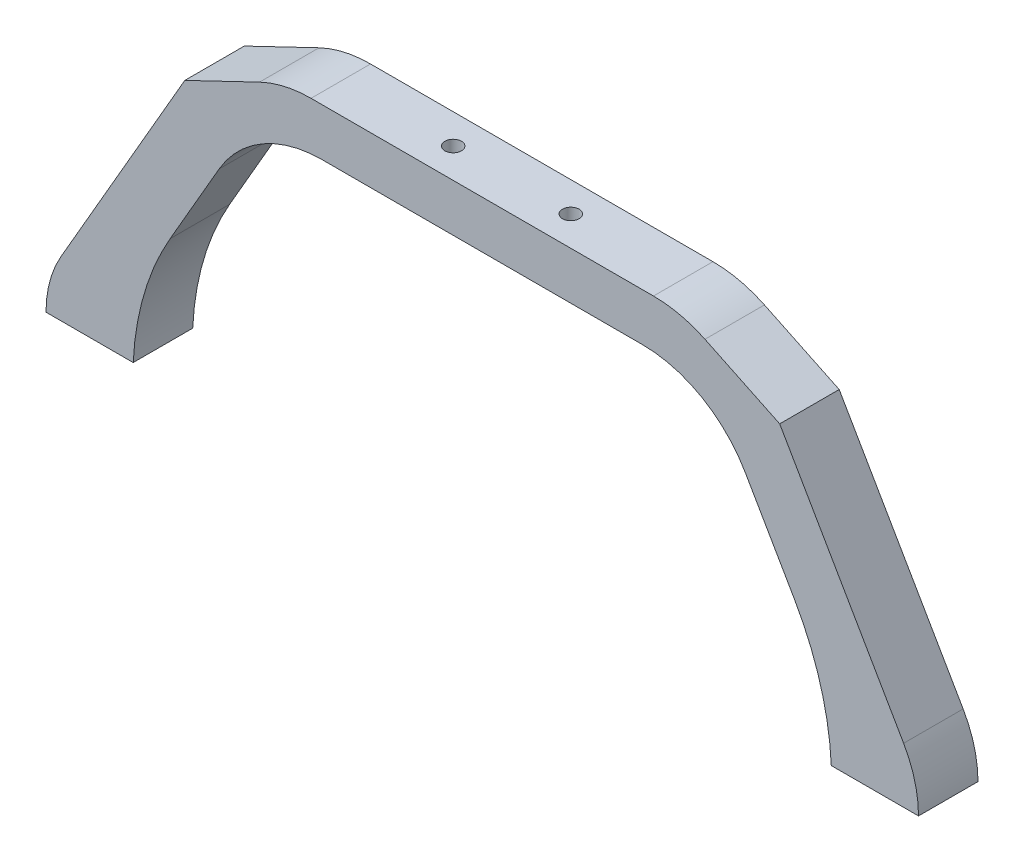
ISO-10303-21;
HEADER;
FILE_DESCRIPTION(('STEP AP214'),'2;1');
FILE_NAME('part.step','',(''),(''),'','','');
FILE_SCHEMA(('AUTOMOTIVE_DESIGN { 1 0 10303 214 1 1 1 1 }'));
ENDSEC;
DATA;
#1=APPLICATION_CONTEXT('core data for automotive mechanical design processes');
#2=APPLICATION_PROTOCOL_DEFINITION('international standard','automotive_design',2000,#1);
#3=PRODUCT_CONTEXT('',#1,'mechanical');
#4=PRODUCT('Part','Part','',(#3));
#5=PRODUCT_RELATED_PRODUCT_CATEGORY('part','',(#4));
#6=PRODUCT_DEFINITION_FORMATION('','',#4);
#7=PRODUCT_DEFINITION_CONTEXT('part definition',#1,'design');
#8=PRODUCT_DEFINITION('design','',#6,#7);
#9=PRODUCT_DEFINITION_SHAPE('','',#8);
#10=(LENGTH_UNIT() NAMED_UNIT(*) SI_UNIT(.MILLI.,.METRE.));
#11=(NAMED_UNIT(*) PLANE_ANGLE_UNIT() SI_UNIT($,.RADIAN.));
#12=(NAMED_UNIT(*) SI_UNIT($,.STERADIAN.) SOLID_ANGLE_UNIT());
#13=UNCERTAINTY_MEASURE_WITH_UNIT(LENGTH_MEASURE(1.E-05),#10,'distance_accuracy_value','');
#14=(GEOMETRIC_REPRESENTATION_CONTEXT(3) GLOBAL_UNCERTAINTY_ASSIGNED_CONTEXT((#13)) GLOBAL_UNIT_ASSIGNED_CONTEXT((#10,
#11,#12)) REPRESENTATION_CONTEXT('',''));
#15=CARTESIAN_POINT('',(0.,0.,0.));
#16=DIRECTION('',(0.,0.,1.));
#17=DIRECTION('',(1.,0.,0.));
#18=AXIS2_PLACEMENT_3D('',#15,#16,#17);
#19=CARTESIAN_POINT('',(14.8320799283025,62.1820813029437,0.));
#20=DIRECTION('',(0.,1.,0.));
#21=DIRECTION('',(0.,0.,1.));
#22=AXIS2_PLACEMENT_3D('',#19,#20,#21);
#23=CYLINDRICAL_SURFACE('',#22,2.1);
#24=CARTESIAN_POINT('',(14.8320799283025,80.1217782649107,0.));
#25=DIRECTION('',(0.,1.,0.));
#26=DIRECTION('',(0.,0.,1.));
#27=AXIS2_PLACEMENT_3D('',#24,#25,#26);
#28=CIRCLE('',#27,2.1);
#29=CARTESIAN_POINT('',(14.8320799283025,80.1217782649107,2.1));
#30=VERTEX_POINT('',#29);
#31=EDGE_CURVE('E297',#30,#30,#28,.T.);
#32=ORIENTED_EDGE('',*,*,#31,.T.);
#33=EDGE_LOOP('',(#32));
#34=FACE_BOUND('',#33,.T.);
#35=CARTESIAN_POINT('',(14.8320799283025,72.1217782649107,0.));
#36=DIRECTION('',(0.,-1.,0.));
#37=DIRECTION('',(0.,0.,-1.));
#38=AXIS2_PLACEMENT_3D('',#35,#36,#37);
#39=CIRCLE('',#38,2.1);
#40=CARTESIAN_POINT('',(14.8320799283025,72.1217782649107,-2.10000000000001));
#41=VERTEX_POINT('',#40);
#42=EDGE_CURVE('E299',#41,#41,#39,.T.);
#43=ORIENTED_EDGE('',*,*,#42,.T.);
#44=EDGE_LOOP('',(#43));
#45=FACE_BOUND('',#44,.T.);
#46=ADVANCED_FACE('F49',(#34,#45),#23,.F.);
#47=CARTESIAN_POINT('',(-14.8320799283025,62.1820813029437,0.));
#48=DIRECTION('',(0.,1.,0.));
#49=DIRECTION('',(0.,0.,1.));
#50=AXIS2_PLACEMENT_3D('',#47,#48,#49);
#51=CYLINDRICAL_SURFACE('',#50,2.1);
#52=CARTESIAN_POINT('',(-14.8320799283025,80.1217782649107,0.));
#53=DIRECTION('',(0.,1.,0.));
#54=DIRECTION('',(0.,0.,1.));
#55=AXIS2_PLACEMENT_3D('',#52,#53,#54);
#56=CIRCLE('',#55,2.1);
#57=CARTESIAN_POINT('',(-14.8320799283025,80.1217782649107,2.1));
#58=VERTEX_POINT('',#57);
#59=EDGE_CURVE('E315',#58,#58,#56,.T.);
#60=ORIENTED_EDGE('',*,*,#59,.T.);
#61=EDGE_LOOP('',(#60));
#62=FACE_BOUND('',#61,.T.);
#63=CARTESIAN_POINT('',(-14.8320799283025,72.1217782649107,0.));
#64=DIRECTION('',(0.,-1.,0.));
#65=DIRECTION('',(0.,0.,-1.));
#66=AXIS2_PLACEMENT_3D('',#63,#64,#65);
#67=CIRCLE('',#66,2.1);
#68=CARTESIAN_POINT('',(-14.8320799283025,72.1217782649107,-2.1));
#69=VERTEX_POINT('',#68);
#70=EDGE_CURVE('E308',#69,#69,#67,.T.);
#71=ORIENTED_EDGE('',*,*,#70,.T.);
#72=EDGE_LOOP('',(#71));
#73=FACE_BOUND('',#72,.T.);
#74=ADVANCED_FACE('F472',(#62,#73),#51,.F.);
#75=CARTESIAN_POINT('',(0.,-1.34593086169958E-13,7.5));
#76=DIRECTION('',(0.,-1.,0.));
#77=DIRECTION('',(1.,0.,0.));
#78=AXIS2_PLACEMENT_3D('',#75,#76,#77);
#79=PLANE('',#78);
#80=DIRECTION('',(-1.,0.,0.));
#81=VECTOR('',#80,1.);
#82=CARTESIAN_POINT('',(0.,-1.34593086169958E-13,-7.5));
#83=LINE('',#82,#81);
#84=CARTESIAN_POINT('',(-88.0096189432335,0.,-7.5));
#85=VERTEX_POINT('',#84);
#86=CARTESIAN_POINT('',(-110.,0.,-7.5));
#87=VERTEX_POINT('',#86);
#88=EDGE_CURVE('E319',#85,#87,#83,.T.);
#89=ORIENTED_EDGE('',*,*,#88,.F.);
#90=DIRECTION('',(0.,0.,-1.));
#91=VECTOR('',#90,1.);
#92=CARTESIAN_POINT('',(-88.0096189432335,0.,7.5));
#93=LINE('',#92,#91);
#94=CARTESIAN_POINT('',(-88.0096189432335,0.,7.5));
#95=VERTEX_POINT('',#94);
#96=EDGE_CURVE('E198',#95,#85,#93,.T.);
#97=ORIENTED_EDGE('',*,*,#96,.F.);
#98=DIRECTION('',(-1.,0.,0.));
#99=VECTOR('',#98,1.);
#100=CARTESIAN_POINT('',(0.,-1.34593086169958E-13,7.5));
#101=LINE('',#100,#99);
#102=CARTESIAN_POINT('',(-110.,0.,7.5));
#103=VERTEX_POINT('',#102);
#104=EDGE_CURVE('E182',#95,#103,#101,.T.);
#105=ORIENTED_EDGE('',*,*,#104,.T.);
#106=DIRECTION('',(0.,0.,-1.));
#107=VECTOR('',#106,1.);
#108=CARTESIAN_POINT('',(-110.,0.,7.5));
#109=LINE('',#108,#107);
#110=EDGE_CURVE('E195',#103,#87,#109,.T.);
#111=ORIENTED_EDGE('',*,*,#110,.T.);
#112=EDGE_LOOP('',(#89,#97,#105,#111));
#113=FACE_BOUND('',#112,.T.);
#114=ADVANCED_FACE('F194',(#113),#79,.T.);
#115=CARTESIAN_POINT('',(-72.757214207425,42.0063972081442,7.5));
#116=DIRECTION('',(0.866025403784438,-0.500000000000001,0.));
#117=DIRECTION('',(0.500000000000001,0.866025403784438,0.));
#118=AXIS2_PLACEMENT_3D('',#115,#116,#117);
#119=PLANE('',#118);
#120=DIRECTION('',(-0.500000000000001,-0.866025403784438,0.));
#121=VECTOR('',#120,1.);
#122=CARTESIAN_POINT('',(-72.757214207425,42.0063972081442,7.5));
#123=LINE('',#122,#121);
#124=CARTESIAN_POINT('',(-66.3397459621556,53.1217782649107,7.5));
#125=VERTEX_POINT('',#124);
#126=CARTESIAN_POINT('',(-78.709369655696,31.696961557191,7.5));
#127=VERTEX_POINT('',#126);
#128=EDGE_CURVE('E200',#125,#127,#123,.T.);
#129=ORIENTED_EDGE('',*,*,#128,.T.);
#130=DIRECTION('',(0.,0.,-1.));
#131=VECTOR('',#130,1.);
#132=CARTESIAN_POINT('',(-78.709369655696,31.696961557191,-7.5));
#133=LINE('',#132,#131);
#134=CARTESIAN_POINT('',(-78.709369655696,31.696961557191,-7.5));
#135=VERTEX_POINT('',#134);
#136=EDGE_CURVE('E222',#127,#135,#133,.T.);
#137=ORIENTED_EDGE('',*,*,#136,.T.);
#138=DIRECTION('',(-0.500000000000001,-0.866025403784438,0.));
#139=VECTOR('',#138,1.);
#140=CARTESIAN_POINT('',(-72.757214207425,42.0063972081442,-7.5));
#141=LINE('',#140,#139);
#142=CARTESIAN_POINT('',(-66.3397459621556,53.1217782649107,-7.5));
#143=VERTEX_POINT('',#142);
#144=EDGE_CURVE('E356',#143,#135,#141,.T.);
#145=ORIENTED_EDGE('',*,*,#144,.F.);
#146=DIRECTION('',(0.,0.,-1.));
#147=VECTOR('',#146,1.);
#148=CARTESIAN_POINT('',(-66.3397459621556,53.1217782649107,7.5));
#149=LINE('',#148,#147);
#150=EDGE_CURVE('E219',#143,#125,#149,.F.);
#151=ORIENTED_EDGE('',*,*,#150,.T.);
#152=EDGE_LOOP('',(#129,#137,#145,#151));
#153=FACE_BOUND('',#152,.T.);
#154=ADVANCED_FACE('F445',(#153),#119,.T.);
#155=CARTESIAN_POINT('',(0.,68.1217782649107,7.5));
#156=DIRECTION('',(0.,-1.,0.));
#157=DIRECTION('',(0.,0.,-1.));
#158=AXIS2_PLACEMENT_3D('',#155,#156,#157);
#159=PLANE('',#158);
#160=CARTESIAN_POINT('',(14.8320799283025,68.1217782649107,0.));
#161=DIRECTION('',(0.,-1.,0.));
#162=DIRECTION('',(0.,0.,-1.));
#163=AXIS2_PLACEMENT_3D('',#160,#161,#162);
#164=CIRCLE('',#163,4.5);
#165=CARTESIAN_POINT('',(14.8320799283025,68.1217782649107,-4.50000000000001));
#166=VERTEX_POINT('',#165);
#167=EDGE_CURVE('E53',#166,#166,#164,.T.);
#168=ORIENTED_EDGE('',*,*,#167,.F.);
#169=EDGE_LOOP('',(#168));
#170=FACE_BOUND('',#169,.T.);
#171=CARTESIAN_POINT('',(-14.8320799283025,68.1217782649107,0.));
#172=DIRECTION('',(0.,-1.,0.));
#173=DIRECTION('',(0.,0.,-1.));
#174=AXIS2_PLACEMENT_3D('',#171,#172,#173);
#175=CIRCLE('',#174,4.5);
#176=CARTESIAN_POINT('',(-14.8320799283025,68.1217782649107,-4.5));
#177=VERTEX_POINT('',#176);
#178=EDGE_CURVE('E288',#177,#177,#175,.T.);
#179=ORIENTED_EDGE('',*,*,#178,.F.);
#180=EDGE_LOOP('',(#179));
#181=FACE_BOUND('',#180,.T.);
#182=DIRECTION('',(-1.,0.,0.));
#183=VECTOR('',#182,1.);
#184=CARTESIAN_POINT('',(0.,68.1217782649107,-7.5));
#185=LINE('',#184,#183);
#186=CARTESIAN_POINT('',(40.3589838486224,68.1217782649107,-7.5));
#187=VERTEX_POINT('',#186);
#188=CARTESIAN_POINT('',(-40.3589838486224,68.1217782649107,-7.5));
#189=VERTEX_POINT('',#188);
#190=EDGE_CURVE('E360',#187,#189,#185,.T.);
#191=ORIENTED_EDGE('',*,*,#190,.F.);
#192=DIRECTION('',(0.,0.,-1.));
#193=VECTOR('',#192,1.);
#194=CARTESIAN_POINT('',(40.3589838486224,68.1217782649107,7.5));
#195=LINE('',#194,#193);
#196=CARTESIAN_POINT('',(40.3589838486224,68.1217782649107,7.5));
#197=VERTEX_POINT('',#196);
#198=EDGE_CURVE('E230',#187,#197,#195,.F.);
#199=ORIENTED_EDGE('',*,*,#198,.T.);
#200=DIRECTION('',(-1.,0.,0.));
#201=VECTOR('',#200,1.);
#202=CARTESIAN_POINT('',(0.,68.1217782649107,7.5));
#203=LINE('',#202,#201);
#204=CARTESIAN_POINT('',(-40.3589838486224,68.1217782649107,7.5));
#205=VERTEX_POINT('',#204);
#206=EDGE_CURVE('E326',#197,#205,#203,.T.);
#207=ORIENTED_EDGE('',*,*,#206,.T.);
#208=DIRECTION('',(0.,0.,-1.));
#209=VECTOR('',#208,1.);
#210=CARTESIAN_POINT('',(-40.3589838486224,68.1217782649107,-7.5));
#211=LINE('',#210,#209);
#212=EDGE_CURVE('E226',#205,#189,#211,.T.);
#213=ORIENTED_EDGE('',*,*,#212,.T.);
#214=EDGE_LOOP('',(#191,#199,#207,#213));
#215=FACE_BOUND('',#214,.T.);
#216=ADVANCED_FACE('F433',(#170,#181,#215),#159,.T.);
#217=CARTESIAN_POINT('',(72.757214207425,42.0063972081442,7.5));
#218=DIRECTION('',(0.866025403784438,0.500000000000001,0.));
#219=DIRECTION('',(-0.500000000000001,0.866025403784438,0.));
#220=AXIS2_PLACEMENT_3D('',#217,#218,#219);
#221=PLANE('',#220);
#222=DIRECTION('',(0.500000000000001,-0.866025403784438,0.));
#223=VECTOR('',#222,1.);
#224=CARTESIAN_POINT('',(72.757214207425,42.0063972081442,-7.5));
#225=LINE('',#224,#223);
#226=CARTESIAN_POINT('',(66.3397459621556,53.1217782649107,-7.5));
#227=VERTEX_POINT('',#226);
#228=CARTESIAN_POINT('',(78.709369655696,31.696961557191,-7.5));
#229=VERTEX_POINT('',#228);
#230=EDGE_CURVE('E364',#227,#229,#225,.T.);
#231=ORIENTED_EDGE('',*,*,#230,.T.);
#232=DIRECTION('',(0.,0.,-1.));
#233=VECTOR('',#232,1.);
#234=CARTESIAN_POINT('',(78.709369655696,31.696961557191,7.5));
#235=LINE('',#234,#233);
#236=CARTESIAN_POINT('',(78.709369655696,31.696961557191,7.5));
#237=VERTEX_POINT('',#236);
#238=EDGE_CURVE('E211',#229,#237,#235,.F.);
#239=ORIENTED_EDGE('',*,*,#238,.T.);
#240=DIRECTION('',(0.500000000000001,-0.866025403784438,0.));
#241=VECTOR('',#240,1.);
#242=CARTESIAN_POINT('',(72.757214207425,42.0063972081442,7.5));
#243=LINE('',#242,#241);
#244=CARTESIAN_POINT('',(66.3397459621556,53.1217782649107,7.5));
#245=VERTEX_POINT('',#244);
#246=EDGE_CURVE('E330',#245,#237,#243,.T.);
#247=ORIENTED_EDGE('',*,*,#246,.F.);
#248=DIRECTION('',(0.,0.,-1.));
#249=VECTOR('',#248,1.);
#250=CARTESIAN_POINT('',(66.3397459621556,53.1217782649107,7.5));
#251=LINE('',#250,#249);
#252=EDGE_CURVE('E206',#245,#227,#251,.T.);
#253=ORIENTED_EDGE('',*,*,#252,.T.);
#254=EDGE_LOOP('',(#231,#239,#247,#253));
#255=FACE_BOUND('',#254,.T.);
#256=ADVANCED_FACE('F427',(#255),#221,.F.);
#257=CARTESIAN_POINT('',(0.,-1.34593086169958E-13,7.5));
#258=DIRECTION('',(0.,1.,0.));
#259=DIRECTION('',(-1.,0.,0.));
#260=AXIS2_PLACEMENT_3D('',#257,#258,#259);
#261=PLANE('',#260);
#262=DIRECTION('',(1.,0.,0.));
#263=VECTOR('',#262,1.);
#264=CARTESIAN_POINT('',(0.,-1.34593086169958E-13,-7.5));
#265=LINE('',#264,#263);
#266=CARTESIAN_POINT('',(88.0096189432335,0.,-7.5));
#267=VERTEX_POINT('',#266);
#268=CARTESIAN_POINT('',(110.,0.,-7.5));
#269=VERTEX_POINT('',#268);
#270=EDGE_CURVE('E368',#267,#269,#265,.T.);
#271=ORIENTED_EDGE('',*,*,#270,.T.);
#272=DIRECTION('',(0.,0.,-1.));
#273=VECTOR('',#272,1.);
#274=CARTESIAN_POINT('',(110.,0.,7.5));
#275=LINE('',#274,#273);
#276=CARTESIAN_POINT('',(110.,0.,7.5));
#277=VERTEX_POINT('',#276);
#278=EDGE_CURVE('E396',#277,#269,#275,.T.);
#279=ORIENTED_EDGE('',*,*,#278,.F.);
#280=DIRECTION('',(1.,0.,0.));
#281=VECTOR('',#280,1.);
#282=CARTESIAN_POINT('',(0.,-1.34593086169958E-13,7.5));
#283=LINE('',#282,#281);
#284=CARTESIAN_POINT('',(88.0096189432335,0.,7.5));
#285=VERTEX_POINT('',#284);
#286=EDGE_CURVE('E334',#285,#277,#283,.T.);
#287=ORIENTED_EDGE('',*,*,#286,.F.);
#288=DIRECTION('',(0.,0.,-1.));
#289=VECTOR('',#288,1.);
#290=CARTESIAN_POINT('',(88.0096189432335,0.,7.5));
#291=LINE('',#290,#289);
#292=EDGE_CURVE('E213',#285,#267,#291,.T.);
#293=ORIENTED_EDGE('',*,*,#292,.T.);
#294=EDGE_LOOP('',(#271,#279,#287,#293));
#295=FACE_BOUND('',#294,.T.);
#296=ADVANCED_FACE('F405',(#295),#261,.F.);
#297=CARTESIAN_POINT('',(85.7475952641916,49.5063972081442,7.5));
#298=DIRECTION('',(-0.866025403784438,-0.500000000000001,0.));
#299=DIRECTION('',(0.500000000000001,-0.866025403784438,0.));
#300=AXIS2_PLACEMENT_3D('',#297,#298,#299);
#301=PLANE('',#300);
#302=DIRECTION('',(-0.500000000000001,0.866025403784438,0.));
#303=VECTOR('',#302,1.);
#304=CARTESIAN_POINT('',(85.7475952641916,49.5063972081442,7.5));
#305=LINE('',#304,#303);
#306=CARTESIAN_POINT('',(106.248711424607,13.9974224064335,7.5));
#307=VERTEX_POINT('',#306);
#308=CARTESIAN_POINT('',(75.,68.1217782649107,7.5));
#309=VERTEX_POINT('',#308);
#310=EDGE_CURVE('E337',#307,#309,#305,.T.);
#311=ORIENTED_EDGE('',*,*,#310,.F.);
#312=DIRECTION('',(0.,0.,-1.));
#313=VECTOR('',#312,1.);
#314=CARTESIAN_POINT('',(106.248711424607,13.9974224064335,7.5));
#315=LINE('',#314,#313);
#316=CARTESIAN_POINT('',(106.248711424607,13.9974224064335,-7.5));
#317=VERTEX_POINT('',#316);
#318=EDGE_CURVE('E257',#307,#317,#315,.T.);
#319=ORIENTED_EDGE('',*,*,#318,.T.);
#320=DIRECTION('',(-0.500000000000001,0.866025403784438,0.));
#321=VECTOR('',#320,1.);
#322=CARTESIAN_POINT('',(85.7475952641916,49.5063972081442,-7.5));
#323=LINE('',#322,#321);
#324=CARTESIAN_POINT('',(75.,68.1217782649107,-7.5));
#325=VERTEX_POINT('',#324);
#326=EDGE_CURVE('E372',#317,#325,#323,.T.);
#327=ORIENTED_EDGE('',*,*,#326,.T.);
#328=DIRECTION('',(0.,0.,-1.));
#329=VECTOR('',#328,1.);
#330=CARTESIAN_POINT('',(75.,68.1217782649107,7.5));
#331=LINE('',#330,#329);
#332=EDGE_CURVE('E392',#309,#325,#331,.T.);
#333=ORIENTED_EDGE('',*,*,#332,.F.);
#334=EDGE_LOOP('',(#311,#319,#327,#333));
#335=FACE_BOUND('',#334,.T.);
#336=ADVANCED_FACE('F419',(#335),#301,.F.);
#337=CARTESIAN_POINT('',(40.6196794271433,84.6243321398819,7.5));
#338=DIRECTION('',(0.432731067584771,0.901523057468273,0.));
#339=DIRECTION('',(-0.901523057468274,0.432731067584771,0.));
#340=AXIS2_PLACEMENT_3D('',#337,#338,#339);
#341=PLANE('',#340);
#342=DIRECTION('',(0.901523057468274,-0.432731067584771,0.));
#343=VECTOR('',#342,1.);
#344=CARTESIAN_POINT('',(40.6196794271433,84.6243321398819,-7.5));
#345=LINE('',#344,#343);
#346=CARTESIAN_POINT('',(56.1548089082329,77.1674699889589,-7.5));
#347=VERTEX_POINT('',#346);
#348=EDGE_CURVE('E376',#347,#325,#345,.T.);
#349=ORIENTED_EDGE('',*,*,#348,.F.);
#350=DIRECTION('',(0.,0.,-1.));
#351=VECTOR('',#350,1.);
#352=CARTESIAN_POINT('',(56.1548089082329,77.1674699889589,7.5));
#353=LINE('',#352,#351);
#354=CARTESIAN_POINT('',(56.1548089082329,77.1674699889589,7.5));
#355=VERTEX_POINT('',#354);
#356=EDGE_CURVE('E59',#347,#355,#353,.F.);
#357=ORIENTED_EDGE('',*,*,#356,.T.);
#358=DIRECTION('',(0.901523057468274,-0.432731067584771,0.));
#359=VECTOR('',#358,1.);
#360=CARTESIAN_POINT('',(40.6196794271433,84.6243321398819,7.5));
#361=LINE('',#360,#359);
#362=EDGE_CURVE('E341',#355,#309,#361,.T.);
#363=ORIENTED_EDGE('',*,*,#362,.T.);
#364=ORIENTED_EDGE('',*,*,#332,.T.);
#365=EDGE_LOOP('',(#349,#357,#363,#364));
#366=FACE_BOUND('',#365,.T.);
#367=ADVANCED_FACE('F492',(#366),#341,.T.);
#368=CARTESIAN_POINT('',(0.,80.1217782649107,7.5));
#369=DIRECTION('',(0.,1.,0.));
#370=DIRECTION('',(0.,0.,1.));
#371=AXIS2_PLACEMENT_3D('',#368,#369,#370);
#372=PLANE('',#371);
#373=ORIENTED_EDGE('',*,*,#59,.F.);
#374=EDGE_LOOP('',(#373));
#375=FACE_BOUND('',#374,.T.);
#376=ORIENTED_EDGE('',*,*,#31,.F.);
#377=EDGE_LOOP('',(#376));
#378=FACE_BOUND('',#377,.T.);
#379=DIRECTION('',(1.,0.,0.));
#380=VECTOR('',#379,1.);
#381=CARTESIAN_POINT('',(0.,80.1217782649107,7.5));
#382=LINE('',#381,#380);
#383=CARTESIAN_POINT('',(-43.1728768806898,80.1217782649107,7.5));
#384=VERTEX_POINT('',#383);
#385=CARTESIAN_POINT('',(43.1728768806898,80.1217782649107,7.5));
#386=VERTEX_POINT('',#385);
#387=EDGE_CURVE('E344',#384,#386,#382,.T.);
#388=ORIENTED_EDGE('',*,*,#387,.T.);
#389=DIRECTION('',(0.,0.,-1.));
#390=VECTOR('',#389,1.);
#391=CARTESIAN_POINT('',(43.1728768806898,80.1217782649107,7.5));
#392=LINE('',#391,#390);
#393=CARTESIAN_POINT('',(43.1728768806898,80.1217782649107,-7.5));
#394=VERTEX_POINT('',#393);
#395=EDGE_CURVE('E283',#386,#394,#392,.T.);
#396=ORIENTED_EDGE('',*,*,#395,.T.);
#397=DIRECTION('',(1.,0.,0.));
#398=VECTOR('',#397,1.);
#399=CARTESIAN_POINT('',(0.,80.1217782649107,-7.5));
#400=LINE('',#399,#398);
#401=CARTESIAN_POINT('',(-43.1728768806898,80.1217782649107,-7.5));
#402=VERTEX_POINT('',#401);
#403=EDGE_CURVE('E379',#402,#394,#400,.T.);
#404=ORIENTED_EDGE('',*,*,#403,.F.);
#405=DIRECTION('',(0.,0.,-1.));
#406=VECTOR('',#405,1.);
#407=CARTESIAN_POINT('',(-43.1728768806898,80.1217782649107,7.5));
#408=LINE('',#407,#406);
#409=EDGE_CURVE('E280',#402,#384,#408,.F.);
#410=ORIENTED_EDGE('',*,*,#409,.T.);
#411=EDGE_LOOP('',(#388,#396,#404,#410));
#412=FACE_BOUND('',#411,.T.);
#413=ADVANCED_FACE('F459',(#375,#378,#412),#372,.T.);
#414=CARTESIAN_POINT('',(-40.6196794271433,84.6243321398819,7.5));
#415=DIRECTION('',(-0.432731067584771,0.901523057468273,0.));
#416=DIRECTION('',(-0.901523057468274,-0.432731067584771,0.));
#417=AXIS2_PLACEMENT_3D('',#414,#415,#416);
#418=PLANE('',#417);
#419=DIRECTION('',(0.901523057468274,0.432731067584771,0.));
#420=VECTOR('',#419,1.);
#421=CARTESIAN_POINT('',(-40.6196794271433,84.6243321398819,7.5));
#422=LINE('',#421,#420);
#423=CARTESIAN_POINT('',(-75.,68.1217782649107,7.5));
#424=VERTEX_POINT('',#423);
#425=CARTESIAN_POINT('',(-56.1548089082329,77.1674699889589,7.5));
#426=VERTEX_POINT('',#425);
#427=EDGE_CURVE('E348',#424,#426,#422,.T.);
#428=ORIENTED_EDGE('',*,*,#427,.T.);
#429=DIRECTION('',(0.,0.,-1.));
#430=VECTOR('',#429,1.);
#431=CARTESIAN_POINT('',(-56.1548089082329,77.1674699889589,7.5));
#432=LINE('',#431,#430);
#433=CARTESIAN_POINT('',(-56.1548089082329,77.1674699889589,-7.5));
#434=VERTEX_POINT('',#433);
#435=EDGE_CURVE('E12',#426,#434,#432,.T.);
#436=ORIENTED_EDGE('',*,*,#435,.T.);
#437=DIRECTION('',(0.901523057468274,0.432731067584771,0.));
#438=VECTOR('',#437,1.);
#439=CARTESIAN_POINT('',(-40.6196794271433,84.6243321398819,-7.5));
#440=LINE('',#439,#438);
#441=CARTESIAN_POINT('',(-75.,68.1217782649107,-7.5));
#442=VERTEX_POINT('',#441);
#443=EDGE_CURVE('E383',#442,#434,#440,.T.);
#444=ORIENTED_EDGE('',*,*,#443,.F.);
#445=DIRECTION('',(0.,0.,-1.));
#446=VECTOR('',#445,1.);
#447=CARTESIAN_POINT('',(-75.,68.1217782649107,7.5));
#448=LINE('',#447,#446);
#449=EDGE_CURVE('E353',#424,#442,#448,.T.);
#450=ORIENTED_EDGE('',*,*,#449,.F.);
#451=EDGE_LOOP('',(#428,#436,#444,#450));
#452=FACE_BOUND('',#451,.T.);
#453=ADVANCED_FACE('F453',(#452),#418,.T.);
#454=CARTESIAN_POINT('',(-85.7475952641916,49.5063972081442,7.5));
#455=DIRECTION('',(-0.866025403784438,0.500000000000001,0.));
#456=DIRECTION('',(-0.500000000000001,-0.866025403784438,0.));
#457=AXIS2_PLACEMENT_3D('',#454,#455,#456);
#458=PLANE('',#457);
#459=DIRECTION('',(0.500000000000001,0.866025403784438,0.));
#460=VECTOR('',#459,1.);
#461=CARTESIAN_POINT('',(-85.7475952641916,49.5063972081442,-7.5));
#462=LINE('',#461,#460);
#463=CARTESIAN_POINT('',(-106.248711424607,13.9974224064335,-7.5));
#464=VERTEX_POINT('',#463);
#465=EDGE_CURVE('E201',#464,#442,#462,.T.);
#466=ORIENTED_EDGE('',*,*,#465,.F.);
#467=DIRECTION('',(0.,0.,-1.));
#468=VECTOR('',#467,1.);
#469=CARTESIAN_POINT('',(-106.248711424607,13.9974224064335,7.5));
#470=LINE('',#469,#468);
#471=CARTESIAN_POINT('',(-106.248711424607,13.9974224064335,7.5));
#472=VERTEX_POINT('',#471);
#473=EDGE_CURVE('E67',#464,#472,#470,.F.);
#474=ORIENTED_EDGE('',*,*,#473,.T.);
#475=DIRECTION('',(0.500000000000001,0.866025403784438,0.));
#476=VECTOR('',#475,1.);
#477=CARTESIAN_POINT('',(-85.7475952641916,49.5063972081442,7.5));
#478=LINE('',#477,#476);
#479=EDGE_CURVE('E184',#472,#424,#478,.T.);
#480=ORIENTED_EDGE('',*,*,#479,.T.);
#481=ORIENTED_EDGE('',*,*,#449,.T.);
#482=EDGE_LOOP('',(#466,#474,#480,#481));
#483=FACE_BOUND('',#482,.T.);
#484=ADVANCED_FACE('F449',(#483),#458,.T.);
#485=CARTESIAN_POINT('',(0.,0.,7.5));
#486=DIRECTION('',(0.,0.,1.));
#487=DIRECTION('',(1.,0.,0.));
#488=AXIS2_PLACEMENT_3D('',#485,#486,#487);
#489=PLANE('',#488);
#490=ORIENTED_EDGE('',*,*,#286,.T.);
#491=CARTESIAN_POINT('',(82.0000001186427,-0.00257759356656756,7.5));
#492=DIRECTION('',(0.,0.,1.));
#493=DIRECTION('',(1.,0.,0.));
#494=AXIS2_PLACEMENT_3D('',#491,#492,#493);
#495=CIRCLE('',#494,28.);
#496=EDGE_CURVE('E188',#277,#307,#495,.T.);
#497=ORIENTED_EDGE('',*,*,#496,.T.);
#498=ORIENTED_EDGE('',*,*,#310,.T.);
#499=ORIENTED_EDGE('',*,*,#362,.F.);
#500=CARTESIAN_POINT('',(43.1728768806898,50.1217782649107,7.5));
#501=DIRECTION('',(0.,0.,1.));
#502=DIRECTION('',(1.,0.,0.));
#503=AXIS2_PLACEMENT_3D('',#500,#501,#502);
#504=CIRCLE('',#503,30.);
#505=EDGE_CURVE('E189',#355,#386,#504,.T.);
#506=ORIENTED_EDGE('',*,*,#505,.T.);
#507=ORIENTED_EDGE('',*,*,#387,.F.);
#508=CARTESIAN_POINT('',(-43.1728768806898,50.1217782649107,7.5));
#509=DIRECTION('',(0.,0.,1.));
#510=DIRECTION('',(1.,0.,0.));
#511=AXIS2_PLACEMENT_3D('',#508,#509,#510);
#512=CIRCLE('',#511,30.);
#513=EDGE_CURVE('E75',#384,#426,#512,.T.);
#514=ORIENTED_EDGE('',*,*,#513,.T.);
#515=ORIENTED_EDGE('',*,*,#427,.F.);
#516=ORIENTED_EDGE('',*,*,#479,.F.);
#517=CARTESIAN_POINT('',(-82.0000001186427,-0.00257759356656756,7.5));
#518=DIRECTION('',(0.,0.,1.));
#519=DIRECTION('',(1.,0.,0.));
#520=AXIS2_PLACEMENT_3D('',#517,#518,#519);
#521=CIRCLE('',#520,28.);
#522=EDGE_CURVE('E179',#472,#103,#521,.T.);
#523=ORIENTED_EDGE('',*,*,#522,.T.);
#524=ORIENTED_EDGE('',*,*,#104,.F.);
#525=CARTESIAN_POINT('',(-18.0875913907853,-3.30303844280911,7.5));
#526=DIRECTION('',(0.,0.,1.));
#527=DIRECTION('',(1.,0.,0.));
#528=AXIS2_PLACEMENT_3D('',#525,#526,#527);
#529=CIRCLE('',#528,70.);
#530=EDGE_CURVE('E242',#95,#127,#529,.F.);
#531=ORIENTED_EDGE('',*,*,#530,.T.);
#532=ORIENTED_EDGE('',*,*,#128,.F.);
#533=CARTESIAN_POINT('',(-40.3589838486224,38.1217782649107,7.5));
#534=DIRECTION('',(0.,0.,1.));
#535=DIRECTION('',(1.,0.,0.));
#536=AXIS2_PLACEMENT_3D('',#533,#534,#535);
#537=CIRCLE('',#536,30.);
#538=EDGE_CURVE('E254',#125,#205,#537,.F.);
#539=ORIENTED_EDGE('',*,*,#538,.T.);
#540=ORIENTED_EDGE('',*,*,#206,.F.);
#541=CARTESIAN_POINT('',(40.3589838486224,38.1217782649107,7.5));
#542=DIRECTION('',(0.,0.,1.));
#543=DIRECTION('',(1.,0.,0.));
#544=AXIS2_PLACEMENT_3D('',#541,#542,#543);
#545=CIRCLE('',#544,30.);
#546=EDGE_CURVE('E248',#197,#245,#545,.F.);
#547=ORIENTED_EDGE('',*,*,#546,.T.);
#548=ORIENTED_EDGE('',*,*,#246,.T.);
#549=CARTESIAN_POINT('',(18.0875913907853,-3.30303844280911,7.5));
#550=DIRECTION('',(0.,0.,1.));
#551=DIRECTION('',(1.,0.,0.));
#552=AXIS2_PLACEMENT_3D('',#549,#550,#551);
#553=CIRCLE('',#552,70.);
#554=EDGE_CURVE('E236',#237,#285,#553,.F.);
#555=ORIENTED_EDGE('',*,*,#554,.T.);
#556=EDGE_LOOP('',(#490,#497,#498,#499,#506,#507,#514,#515,#516,#523,#524,#531,#532,#539,#540,
#547,#548,#555));
#557=FACE_BOUND('',#556,.T.);
#558=ADVANCED_FACE('F181',(#557),#489,.T.);
#559=CARTESIAN_POINT('',(0.,0.,-7.5));
#560=DIRECTION('',(0.,0.,1.));
#561=DIRECTION('',(1.,0.,0.));
#562=AXIS2_PLACEMENT_3D('',#559,#560,#561);
#563=PLANE('',#562);
#564=ORIENTED_EDGE('',*,*,#326,.F.);
#565=CARTESIAN_POINT('',(82.0000001186427,-0.00257759356656756,-7.5));
#566=DIRECTION('',(0.,0.,1.));
#567=DIRECTION('',(1.,0.,0.));
#568=AXIS2_PLACEMENT_3D('',#565,#566,#567);
#569=CIRCLE('',#568,28.);
#570=EDGE_CURVE('E269',#317,#269,#569,.F.);
#571=ORIENTED_EDGE('',*,*,#570,.T.);
#572=ORIENTED_EDGE('',*,*,#270,.F.);
#573=CARTESIAN_POINT('',(18.0875913907853,-3.30303844280911,-7.5));
#574=DIRECTION('',(0.,0.,1.));
#575=DIRECTION('',(1.,0.,0.));
#576=AXIS2_PLACEMENT_3D('',#573,#574,#575);
#577=CIRCLE('',#576,70.);
#578=EDGE_CURVE('E233',#267,#229,#577,.T.);
#579=ORIENTED_EDGE('',*,*,#578,.T.);
#580=ORIENTED_EDGE('',*,*,#230,.F.);
#581=CARTESIAN_POINT('',(40.3589838486224,38.1217782649107,-7.5));
#582=DIRECTION('',(0.,0.,1.));
#583=DIRECTION('',(1.,0.,0.));
#584=AXIS2_PLACEMENT_3D('',#581,#582,#583);
#585=CIRCLE('',#584,30.);
#586=EDGE_CURVE('E245',#227,#187,#585,.T.);
#587=ORIENTED_EDGE('',*,*,#586,.T.);
#588=ORIENTED_EDGE('',*,*,#190,.T.);
#589=CARTESIAN_POINT('',(-40.3589838486224,38.1217782649107,-7.5));
#590=DIRECTION('',(0.,0.,1.));
#591=DIRECTION('',(1.,0.,0.));
#592=AXIS2_PLACEMENT_3D('',#589,#590,#591);
#593=CIRCLE('',#592,30.);
#594=EDGE_CURVE('E251',#189,#143,#593,.T.);
#595=ORIENTED_EDGE('',*,*,#594,.T.);
#596=ORIENTED_EDGE('',*,*,#144,.T.);
#597=CARTESIAN_POINT('',(-18.0875913907853,-3.30303844280911,-7.5));
#598=DIRECTION('',(0.,0.,1.));
#599=DIRECTION('',(1.,0.,0.));
#600=AXIS2_PLACEMENT_3D('',#597,#598,#599);
#601=CIRCLE('',#600,70.);
#602=EDGE_CURVE('E239',#135,#85,#601,.T.);
#603=ORIENTED_EDGE('',*,*,#602,.T.);
#604=ORIENTED_EDGE('',*,*,#88,.T.);
#605=CARTESIAN_POINT('',(-82.0000001186427,-0.00257759356656756,-7.5));
#606=DIRECTION('',(0.,0.,1.));
#607=DIRECTION('',(1.,0.,0.));
#608=AXIS2_PLACEMENT_3D('',#605,#606,#607);
#609=CIRCLE('',#608,28.);
#610=EDGE_CURVE('E204',#87,#464,#609,.F.);
#611=ORIENTED_EDGE('',*,*,#610,.T.);
#612=ORIENTED_EDGE('',*,*,#465,.T.);
#613=ORIENTED_EDGE('',*,*,#443,.T.);
#614=CARTESIAN_POINT('',(-43.1728768806898,50.1217782649107,-7.5));
#615=DIRECTION('',(0.,0.,1.));
#616=DIRECTION('',(1.,0.,0.));
#617=AXIS2_PLACEMENT_3D('',#614,#615,#616);
#618=CIRCLE('',#617,30.);
#619=EDGE_CURVE('E261',#434,#402,#618,.F.);
#620=ORIENTED_EDGE('',*,*,#619,.T.);
#621=ORIENTED_EDGE('',*,*,#403,.T.);
#622=CARTESIAN_POINT('',(43.1728768806898,50.1217782649107,-7.5));
#623=DIRECTION('',(0.,0.,1.));
#624=DIRECTION('',(1.,0.,0.));
#625=AXIS2_PLACEMENT_3D('',#622,#623,#624);
#626=CIRCLE('',#625,30.);
#627=EDGE_CURVE('E264',#394,#347,#626,.F.);
#628=ORIENTED_EDGE('',*,*,#627,.T.);
#629=ORIENTED_EDGE('',*,*,#348,.T.);
#630=EDGE_LOOP('',(#564,#571,#572,#579,#580,#587,#588,#595,#596,#603,#604,#611,#612,#613,#620,
#621,#628,#629));
#631=FACE_BOUND('',#630,.T.);
#632=ADVANCED_FACE('F411',(#631),#563,.F.);
#633=CARTESIAN_POINT('',(18.0875913907853,-3.30303844280911,7.5));
#634=DIRECTION('',(0.,0.,-1.));
#635=DIRECTION('',(-1.,0.,0.));
#636=AXIS2_PLACEMENT_3D('',#633,#634,#635);
#637=CYLINDRICAL_SURFACE('',#636,70.);
#638=ORIENTED_EDGE('',*,*,#554,.F.);
#639=ORIENTED_EDGE('',*,*,#238,.F.);
#640=ORIENTED_EDGE('',*,*,#578,.F.);
#641=ORIENTED_EDGE('',*,*,#292,.F.);
#642=EDGE_LOOP('',(#638,#639,#640,#641));
#643=FACE_BOUND('',#642,.T.);
#644=ADVANCED_FACE('F425',(#643),#637,.F.);
#645=CARTESIAN_POINT('',(-18.0875913907853,-3.30303844280911,7.5));
#646=DIRECTION('',(0.,0.,1.));
#647=DIRECTION('',(1.,0.,0.));
#648=AXIS2_PLACEMENT_3D('',#645,#646,#647);
#649=CYLINDRICAL_SURFACE('',#648,70.);
#650=ORIENTED_EDGE('',*,*,#530,.F.);
#651=ORIENTED_EDGE('',*,*,#96,.T.);
#652=ORIENTED_EDGE('',*,*,#602,.F.);
#653=ORIENTED_EDGE('',*,*,#136,.F.);
#654=EDGE_LOOP('',(#650,#651,#652,#653));
#655=FACE_BOUND('',#654,.T.);
#656=ADVANCED_FACE('F448',(#655),#649,.F.);
#657=CARTESIAN_POINT('',(40.3589838486224,38.1217782649107,7.5));
#658=DIRECTION('',(0.,0.,-1.));
#659=DIRECTION('',(-1.,0.,0.));
#660=AXIS2_PLACEMENT_3D('',#657,#658,#659);
#661=CYLINDRICAL_SURFACE('',#660,30.);
#662=ORIENTED_EDGE('',*,*,#546,.F.);
#663=ORIENTED_EDGE('',*,*,#198,.F.);
#664=ORIENTED_EDGE('',*,*,#586,.F.);
#665=ORIENTED_EDGE('',*,*,#252,.F.);
#666=EDGE_LOOP('',(#662,#663,#664,#665));
#667=FACE_BOUND('',#666,.T.);
#668=ADVANCED_FACE('F437',(#667),#661,.F.);
#669=CARTESIAN_POINT('',(-40.3589838486224,38.1217782649107,7.5));
#670=DIRECTION('',(0.,0.,1.));
#671=DIRECTION('',(1.,0.,0.));
#672=AXIS2_PLACEMENT_3D('',#669,#670,#671);
#673=CYLINDRICAL_SURFACE('',#672,30.);
#674=ORIENTED_EDGE('',*,*,#538,.F.);
#675=ORIENTED_EDGE('',*,*,#150,.F.);
#676=ORIENTED_EDGE('',*,*,#594,.F.);
#677=ORIENTED_EDGE('',*,*,#212,.F.);
#678=EDGE_LOOP('',(#674,#675,#676,#677));
#679=FACE_BOUND('',#678,.T.);
#680=ADVANCED_FACE('F441',(#679),#673,.F.);
#681=CARTESIAN_POINT('',(82.0000001186427,-0.00257759356656756,7.5));
#682=DIRECTION('',(0.,0.,-1.));
#683=DIRECTION('',(-1.,0.,0.));
#684=AXIS2_PLACEMENT_3D('',#681,#682,#683);
#685=CYLINDRICAL_SURFACE('',#684,28.);
#686=ORIENTED_EDGE('',*,*,#496,.F.);
#687=ORIENTED_EDGE('',*,*,#278,.T.);
#688=ORIENTED_EDGE('',*,*,#570,.F.);
#689=ORIENTED_EDGE('',*,*,#318,.F.);
#690=EDGE_LOOP('',(#686,#687,#688,#689));
#691=FACE_BOUND('',#690,.T.);
#692=ADVANCED_FACE('F416',(#691),#685,.T.);
#693=CARTESIAN_POINT('',(-82.0000001186427,-0.00257759356656756,7.5));
#694=DIRECTION('',(0.,0.,1.));
#695=DIRECTION('',(1.,0.,0.));
#696=AXIS2_PLACEMENT_3D('',#693,#694,#695);
#697=CYLINDRICAL_SURFACE('',#696,28.);
#698=ORIENTED_EDGE('',*,*,#522,.F.);
#699=ORIENTED_EDGE('',*,*,#473,.F.);
#700=ORIENTED_EDGE('',*,*,#610,.F.);
#701=ORIENTED_EDGE('',*,*,#110,.F.);
#702=EDGE_LOOP('',(#698,#699,#700,#701));
#703=FACE_BOUND('',#702,.T.);
#704=ADVANCED_FACE('F203',(#703),#697,.T.);
#705=CARTESIAN_POINT('',(43.1728768806898,50.1217782649107,7.5));
#706=DIRECTION('',(0.,0.,-1.));
#707=DIRECTION('',(-1.,0.,0.));
#708=AXIS2_PLACEMENT_3D('',#705,#706,#707);
#709=CYLINDRICAL_SURFACE('',#708,30.);
#710=ORIENTED_EDGE('',*,*,#505,.F.);
#711=ORIENTED_EDGE('',*,*,#356,.F.);
#712=ORIENTED_EDGE('',*,*,#627,.F.);
#713=ORIENTED_EDGE('',*,*,#395,.F.);
#714=EDGE_LOOP('',(#710,#711,#712,#713));
#715=FACE_BOUND('',#714,.T.);
#716=ADVANCED_FACE('F463',(#715),#709,.T.);
#717=CARTESIAN_POINT('',(-43.1728768806898,50.1217782649107,7.5));
#718=DIRECTION('',(0.,0.,-1.));
#719=DIRECTION('',(-1.,0.,0.));
#720=AXIS2_PLACEMENT_3D('',#717,#718,#719);
#721=CYLINDRICAL_SURFACE('',#720,30.);
#722=ORIENTED_EDGE('',*,*,#513,.F.);
#723=ORIENTED_EDGE('',*,*,#409,.F.);
#724=ORIENTED_EDGE('',*,*,#619,.F.);
#725=ORIENTED_EDGE('',*,*,#435,.F.);
#726=EDGE_LOOP('',(#722,#723,#724,#725));
#727=FACE_BOUND('',#726,.T.);
#728=ADVANCED_FACE('F51',(#727),#721,.T.);
#729=CARTESIAN_POINT('',(-14.8320799283025,72.1217782649107,0.));
#730=DIRECTION('',(0.,-1.,0.));
#731=DIRECTION('',(0.,0.,-1.));
#732=AXIS2_PLACEMENT_3D('',#729,#730,#731);
#733=CYLINDRICAL_SURFACE('',#732,4.5);
#734=ORIENTED_EDGE('',*,*,#178,.T.);
#735=EDGE_LOOP('',(#734));
#736=FACE_BOUND('',#735,.T.);
#737=CARTESIAN_POINT('',(-14.8320799283025,72.1217782649107,0.));
#738=DIRECTION('',(0.,-1.,0.));
#739=DIRECTION('',(0.,0.,-1.));
#740=AXIS2_PLACEMENT_3D('',#737,#738,#739);
#741=CIRCLE('',#740,4.5);
#742=CARTESIAN_POINT('',(-14.8320799283025,72.1217782649107,-4.5));
#743=VERTEX_POINT('',#742);
#744=EDGE_CURVE('E305',#743,#743,#741,.T.);
#745=ORIENTED_EDGE('',*,*,#744,.F.);
#746=EDGE_LOOP('',(#745));
#747=FACE_BOUND('',#746,.T.);
#748=ADVANCED_FACE('F462',(#736,#747),#733,.F.);
#749=CARTESIAN_POINT('',(-14.8320799283025,72.1217782649107,0.));
#750=DIRECTION('',(0.,-1.,0.));
#751=DIRECTION('',(0.,0.,-1.));
#752=AXIS2_PLACEMENT_3D('',#749,#750,#751);
#753=PLANE('',#752);
#754=ORIENTED_EDGE('',*,*,#70,.F.);
#755=EDGE_LOOP('',(#754));
#756=FACE_BOUND('',#755,.T.);
#757=ORIENTED_EDGE('',*,*,#744,.T.);
#758=EDGE_LOOP('',(#757));
#759=FACE_BOUND('',#758,.T.);
#760=ADVANCED_FACE('F469',(#756,#759),#753,.T.);
#761=CARTESIAN_POINT('',(14.8320799283025,72.1217782649107,0.));
#762=DIRECTION('',(0.,-1.,0.));
#763=DIRECTION('',(0.,0.,-1.));
#764=AXIS2_PLACEMENT_3D('',#761,#762,#763);
#765=CYLINDRICAL_SURFACE('',#764,4.5);
#766=ORIENTED_EDGE('',*,*,#167,.T.);
#767=EDGE_LOOP('',(#766));
#768=FACE_BOUND('',#767,.T.);
#769=CARTESIAN_POINT('',(14.8320799283025,72.1217782649107,0.));
#770=DIRECTION('',(0.,-1.,0.));
#771=DIRECTION('',(0.,0.,-1.));
#772=AXIS2_PLACEMENT_3D('',#769,#770,#771);
#773=CIRCLE('',#772,4.5);
#774=CARTESIAN_POINT('',(14.8320799283025,72.1217782649107,-4.50000000000001));
#775=VERTEX_POINT('',#774);
#776=EDGE_CURVE('E291',#775,#775,#773,.T.);
#777=ORIENTED_EDGE('',*,*,#776,.F.);
#778=EDGE_LOOP('',(#777));
#779=FACE_BOUND('',#778,.T.);
#780=ADVANCED_FACE('F559',(#768,#779),#765,.F.);
#781=CARTESIAN_POINT('',(14.8320799283025,72.1217782649107,0.));
#782=DIRECTION('',(0.,-1.,0.));
#783=DIRECTION('',(0.,0.,-1.));
#784=AXIS2_PLACEMENT_3D('',#781,#782,#783);
#785=PLANE('',#784);
#786=ORIENTED_EDGE('',*,*,#42,.F.);
#787=EDGE_LOOP('',(#786));
#788=FACE_BOUND('',#787,.T.);
#789=ORIENTED_EDGE('',*,*,#776,.T.);
#790=EDGE_LOOP('',(#789));
#791=FACE_BOUND('',#790,.T.);
#792=ADVANCED_FACE('F569',(#788,#791),#785,.T.);
#793=CLOSED_SHELL('',(#46,#74,#114,#154,#216,#256,#296,#336,#367,#413,#453,#484,#558,#632,#644,
#656,#668,#680,#692,#704,#716,#728,#748,#760,#780,#792));
#794=MANIFOLD_SOLID_BREP('B2',#793);
#795=ADVANCED_BREP_SHAPE_REPRESENTATION('',(#18,#794),#14);
#796=SHAPE_DEFINITION_REPRESENTATION(#9,#795);
ENDSEC;
END-ISO-10303-21;
